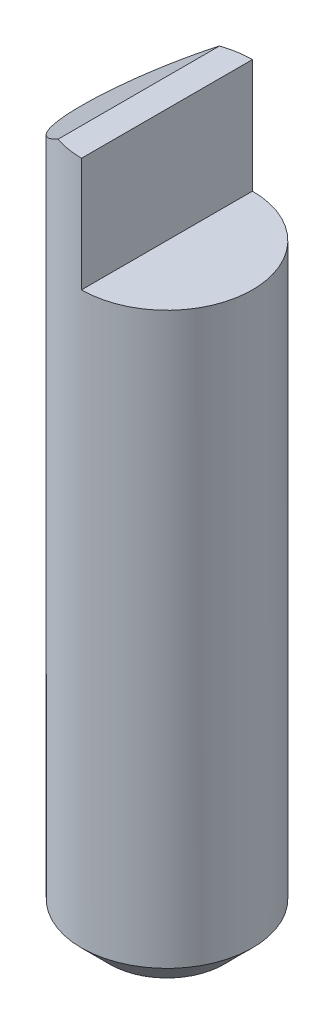
ISO-10303-21;
HEADER;
FILE_DESCRIPTION(('STEP AP214'),'2;1');
FILE_NAME('part.step','',(''),(''),'','','');
FILE_SCHEMA(('AUTOMOTIVE_DESIGN { 1 0 10303 214 1 1 1 1 }'));
ENDSEC;
DATA;
#1=APPLICATION_CONTEXT('core data for automotive mechanical design processes');
#2=APPLICATION_PROTOCOL_DEFINITION('international standard','automotive_design',2000,#1);
#3=PRODUCT_CONTEXT('',#1,'mechanical');
#4=PRODUCT('Part','Part','',(#3));
#5=PRODUCT_RELATED_PRODUCT_CATEGORY('part','',(#4));
#6=PRODUCT_DEFINITION_FORMATION('','',#4);
#7=PRODUCT_DEFINITION_CONTEXT('part definition',#1,'design');
#8=PRODUCT_DEFINITION('design','',#6,#7);
#9=PRODUCT_DEFINITION_SHAPE('','',#8);
#10=(LENGTH_UNIT() NAMED_UNIT(*) SI_UNIT(.MILLI.,.METRE.));
#11=(NAMED_UNIT(*) PLANE_ANGLE_UNIT() SI_UNIT($,.RADIAN.));
#12=(NAMED_UNIT(*) SI_UNIT($,.STERADIAN.) SOLID_ANGLE_UNIT());
#13=UNCERTAINTY_MEASURE_WITH_UNIT(LENGTH_MEASURE(1.E-05),#10,'distance_accuracy_value','');
#14=(GEOMETRIC_REPRESENTATION_CONTEXT(3) GLOBAL_UNCERTAINTY_ASSIGNED_CONTEXT((#13)) GLOBAL_UNIT_ASSIGNED_CONTEXT((#10,
#11,#12)) REPRESENTATION_CONTEXT('',''));
#15=CARTESIAN_POINT('',(0.,0.,0.));
#16=DIRECTION('',(0.,0.,1.));
#17=DIRECTION('',(1.,0.,0.));
#18=AXIS2_PLACEMENT_3D('',#15,#16,#17);
#19=CARTESIAN_POINT('',(0.,25.,0.));
#20=DIRECTION('',(0.,1.,0.));
#21=DIRECTION('',(0.,0.,1.));
#22=AXIS2_PLACEMENT_3D('',#19,#20,#21);
#23=PLANE('',#22);
#24=CARTESIAN_POINT('',(0.,25.,0.));
#25=DIRECTION('',(0.,1.,0.));
#26=DIRECTION('',(0.,0.,1.));
#27=AXIS2_PLACEMENT_3D('',#24,#25,#26);
#28=CIRCLE('',#27,3.);
#29=CARTESIAN_POINT('',(-0.990656870606244,25.,2.83171307951929));
#30=VERTEX_POINT('',#29);
#31=CARTESIAN_POINT('',(0.,25.,3.));
#32=VERTEX_POINT('',#31);
#33=EDGE_CURVE('E95',#30,#32,#28,.T.);
#34=ORIENTED_EDGE('',*,*,#33,.T.);
#35=DIRECTION('',(0.,0.,-1.));
#36=VECTOR('',#35,1.);
#37=CARTESIAN_POINT('',(0.,25.,36.7509469561102));
#38=LINE('',#37,#36);
#39=CARTESIAN_POINT('',(0.,25.,-3.));
#40=VERTEX_POINT('',#39);
#41=EDGE_CURVE('E64',#32,#40,#38,.T.);
#42=ORIENTED_EDGE('',*,*,#41,.T.);
#43=CARTESIAN_POINT('',(-0.990656870606244,25.,-2.83171307951929));
#44=VERTEX_POINT('',#43);
#45=EDGE_CURVE('E77',#40,#44,#28,.T.);
#46=ORIENTED_EDGE('',*,*,#45,.T.);
#47=DIRECTION('',(0.,0.,-1.));
#48=VECTOR('',#47,1.);
#49=CARTESIAN_POINT('',(-0.990656870606244,25.,36.7509469561102));
#50=LINE('',#49,#48);
#51=EDGE_CURVE('E84',#30,#44,#50,.T.);
#52=ORIENTED_EDGE('',*,*,#51,.F.);
#53=EDGE_LOOP('',(#34,#42,#46,#52));
#54=FACE_BOUND('',#53,.T.);
#55=ADVANCED_FACE('F41',(#54),#23,.T.);
#56=CARTESIAN_POINT('',(0.,25.,0.));
#57=DIRECTION('',(0.,-1.,0.));
#58=DIRECTION('',(0.,0.,-1.));
#59=AXIS2_PLACEMENT_3D('',#56,#57,#58);
#60=CYLINDRICAL_SURFACE('',#59,3.);
#61=CARTESIAN_POINT('',(0.,1.,0.));
#62=DIRECTION('',(0.,1.,0.));
#63=DIRECTION('',(0.,0.,1.));
#64=AXIS2_PLACEMENT_3D('',#61,#62,#63);
#65=CIRCLE('',#64,3.);
#66=CARTESIAN_POINT('',(0.,1.,3.));
#67=VERTEX_POINT('',#66);
#68=EDGE_CURVE('E97',#67,#67,#65,.T.);
#69=ORIENTED_EDGE('',*,*,#68,.T.);
#70=EDGE_LOOP('',(#69));
#71=FACE_BOUND('',#70,.T.);
#72=DIRECTION('',(0.,-1.,0.));
#73=VECTOR('',#72,1.);
#74=CARTESIAN_POINT('',(0.,25.,3.));
#75=LINE('',#74,#73);
#76=CARTESIAN_POINT('',(0.,21.,3.));
#77=VERTEX_POINT('',#76);
#78=EDGE_CURVE('E11',#32,#77,#75,.T.);
#79=ORIENTED_EDGE('',*,*,#78,.F.);
#80=ORIENTED_EDGE('',*,*,#33,.F.);
#81=CARTESIAN_POINT('',(0.,25.6902353304222,0.));
#82=DIRECTION('',(-0.571668631627087,0.820484598035584,0.));
#83=DIRECTION('',(-0.820484598035584,-0.571668631627087,0.));
#84=AXIS2_PLACEMENT_3D('',#81,#82,#83);
#85=ELLIPSE('',#84,3.65637576522782,3.);
#86=EDGE_CURVE('E88',#44,#30,#85,.T.);
#87=ORIENTED_EDGE('',*,*,#86,.F.);
#88=ORIENTED_EDGE('',*,*,#45,.F.);
#89=DIRECTION('',(0.,-1.,0.));
#90=VECTOR('',#89,1.);
#91=CARTESIAN_POINT('',(0.,25.,-3.));
#92=LINE('',#91,#90);
#93=CARTESIAN_POINT('',(0.,21.,-3.));
#94=VERTEX_POINT('',#93);
#95=EDGE_CURVE('E50',#94,#40,#92,.F.);
#96=ORIENTED_EDGE('',*,*,#95,.F.);
#97=CARTESIAN_POINT('',(0.,21.,0.));
#98=DIRECTION('',(0.,1.,0.));
#99=DIRECTION('',(0.,0.,1.));
#100=AXIS2_PLACEMENT_3D('',#97,#98,#99);
#101=CIRCLE('',#100,3.);
#102=EDGE_CURVE('E57',#77,#94,#101,.T.);
#103=ORIENTED_EDGE('',*,*,#102,.F.);
#104=EDGE_LOOP('',(#79,#80,#87,#88,#96,#103));
#105=FACE_BOUND('',#104,.T.);
#106=ADVANCED_FACE('F75',(#71,#105),#60,.T.);
#107=CARTESIAN_POINT('',(0.,0.,0.));
#108=DIRECTION('',(0.,1.,0.));
#109=DIRECTION('',(0.,0.,1.));
#110=AXIS2_PLACEMENT_3D('',#107,#108,#109);
#111=PLANE('',#110);
#112=CARTESIAN_POINT('',(0.,0.,0.));
#113=DIRECTION('',(0.,1.,0.));
#114=DIRECTION('',(0.,0.,1.));
#115=AXIS2_PLACEMENT_3D('',#112,#113,#114);
#116=CIRCLE('',#115,1.99999999999999);
#117=CARTESIAN_POINT('',(0.,0.,1.99999999999999));
#118=VERTEX_POINT('',#117);
#119=EDGE_CURVE('E93',#118,#118,#116,.F.);
#120=ORIENTED_EDGE('',*,*,#119,.T.);
#121=EDGE_LOOP('',(#120));
#122=FACE_BOUND('',#121,.T.);
#123=ADVANCED_FACE('F103',(#122),#111,.F.);
#124=CARTESIAN_POINT('',(0.,1.,0.));
#125=DIRECTION('',(0.,1.,0.));
#126=DIRECTION('',(0.,0.,1.));
#127=AXIS2_PLACEMENT_3D('',#124,#125,#126);
#128=CONICAL_SURFACE('',#127,3.,0.78539816339745);
#129=ORIENTED_EDGE('',*,*,#119,.F.);
#130=EDGE_LOOP('',(#129));
#131=FACE_BOUND('',#130,.T.);
#132=ORIENTED_EDGE('',*,*,#68,.F.);
#133=EDGE_LOOP('',(#132));
#134=FACE_BOUND('',#133,.T.);
#135=ADVANCED_FACE('F44',(#131,#134),#128,.T.);
#136=CARTESIAN_POINT('',(-3.,23.6,36.7509469561102));
#137=DIRECTION('',(-0.571668631627087,0.820484598035584,0.));
#138=DIRECTION('',(-0.820484598035584,-0.571668631627087,0.));
#139=AXIS2_PLACEMENT_3D('',#136,#137,#138);
#140=PLANE('',#139);
#141=ORIENTED_EDGE('',*,*,#86,.T.);
#142=ORIENTED_EDGE('',*,*,#51,.T.);
#143=EDGE_LOOP('',(#141,#142));
#144=FACE_BOUND('',#143,.T.);
#145=ADVANCED_FACE('F107',(#144),#140,.T.);
#146=CARTESIAN_POINT('',(0.,25.,36.7509469561102));
#147=DIRECTION('',(1.,0.,0.));
#148=DIRECTION('',(0.,0.,-1.));
#149=AXIS2_PLACEMENT_3D('',#146,#147,#148);
#150=PLANE('',#149);
#151=ORIENTED_EDGE('',*,*,#41,.F.);
#152=ORIENTED_EDGE('',*,*,#78,.T.);
#153=DIRECTION('',(0.,0.,-1.));
#154=VECTOR('',#153,1.);
#155=CARTESIAN_POINT('',(0.,21.,36.7509469561102));
#156=LINE('',#155,#154);
#157=EDGE_CURVE('E83',#77,#94,#156,.T.);
#158=ORIENTED_EDGE('',*,*,#157,.T.);
#159=ORIENTED_EDGE('',*,*,#95,.T.);
#160=EDGE_LOOP('',(#151,#152,#158,#159));
#161=FACE_BOUND('',#160,.T.);
#162=ADVANCED_FACE('F86',(#161),#150,.T.);
#163=CARTESIAN_POINT('',(0.,21.,36.7509469561102));
#164=DIRECTION('',(0.,1.,0.));
#165=DIRECTION('',(0.,0.,1.));
#166=AXIS2_PLACEMENT_3D('',#163,#164,#165);
#167=PLANE('',#166);
#168=ORIENTED_EDGE('',*,*,#157,.F.);
#169=ORIENTED_EDGE('',*,*,#102,.T.);
#170=EDGE_LOOP('',(#168,#169));
#171=FACE_BOUND('',#170,.T.);
#172=ADVANCED_FACE('F82',(#171),#167,.T.);
#173=CLOSED_SHELL('',(#55,#106,#123,#135,#145,#162,#172));
#174=MANIFOLD_SOLID_BREP('B2',#173);
#175=ADVANCED_BREP_SHAPE_REPRESENTATION('',(#18,#174),#14);
#176=SHAPE_DEFINITION_REPRESENTATION(#9,#175);
ENDSEC;
END-ISO-10303-21;
